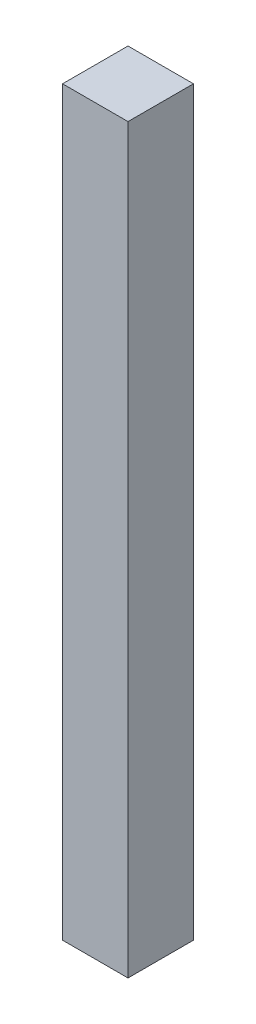
ISO-10303-21;
HEADER;
FILE_DESCRIPTION(('STEP AP214'),'2;1');
FILE_NAME('part.step','',(''),(''),'','','');
FILE_SCHEMA(('AUTOMOTIVE_DESIGN { 1 0 10303 214 1 1 1 1 }'));
ENDSEC;
DATA;
#1=APPLICATION_CONTEXT('core data for automotive mechanical design processes');
#2=APPLICATION_PROTOCOL_DEFINITION('international standard','automotive_design',2000,#1);
#3=PRODUCT_CONTEXT('',#1,'mechanical');
#4=PRODUCT('Part','Part','',(#3));
#5=PRODUCT_RELATED_PRODUCT_CATEGORY('part','',(#4));
#6=PRODUCT_DEFINITION_FORMATION('','',#4);
#7=PRODUCT_DEFINITION_CONTEXT('part definition',#1,'design');
#8=PRODUCT_DEFINITION('design','',#6,#7);
#9=PRODUCT_DEFINITION_SHAPE('','',#8);
#10=(LENGTH_UNIT() NAMED_UNIT(*) SI_UNIT(.MILLI.,.METRE.));
#11=(NAMED_UNIT(*) PLANE_ANGLE_UNIT() SI_UNIT($,.RADIAN.));
#12=(NAMED_UNIT(*) SI_UNIT($,.STERADIAN.) SOLID_ANGLE_UNIT());
#13=UNCERTAINTY_MEASURE_WITH_UNIT(LENGTH_MEASURE(1.E-05),#10,'distance_accuracy_value','');
#14=(GEOMETRIC_REPRESENTATION_CONTEXT(3) GLOBAL_UNCERTAINTY_ASSIGNED_CONTEXT((#13)) GLOBAL_UNIT_ASSIGNED_CONTEXT((#10,
#11,#12)) REPRESENTATION_CONTEXT('',''));
#15=CARTESIAN_POINT('',(0.,0.,0.));
#16=DIRECTION('',(0.,0.,1.));
#17=DIRECTION('',(1.,0.,0.));
#18=AXIS2_PLACEMENT_3D('',#15,#16,#17);
#19=CARTESIAN_POINT('',(-3.,68.,-3.));
#20=DIRECTION('',(1.,0.,0.));
#21=DIRECTION('',(0.,0.,-1.));
#22=AXIS2_PLACEMENT_3D('',#19,#20,#21);
#23=PLANE('',#22);
#24=DIRECTION('',(0.,0.,1.));
#25=VECTOR('',#24,1.);
#26=CARTESIAN_POINT('',(-3.,0.,-3.));
#27=LINE('',#26,#25);
#28=CARTESIAN_POINT('',(-3.,0.,-3.));
#29=VERTEX_POINT('',#28);
#30=CARTESIAN_POINT('',(-3.,0.,3.));
#31=VERTEX_POINT('',#30);
#32=EDGE_CURVE('E96',#29,#31,#27,.T.);
#33=ORIENTED_EDGE('',*,*,#32,.T.);
#34=DIRECTION('',(0.,-1.,0.));
#35=VECTOR('',#34,1.);
#36=CARTESIAN_POINT('',(-3.,68.,3.));
#37=LINE('',#36,#35);
#38=CARTESIAN_POINT('',(-3.,68.,3.));
#39=VERTEX_POINT('',#38);
#40=EDGE_CURVE('E11',#39,#31,#37,.T.);
#41=ORIENTED_EDGE('',*,*,#40,.F.);
#42=DIRECTION('',(0.,0.,1.));
#43=VECTOR('',#42,1.);
#44=CARTESIAN_POINT('',(-3.,68.,-3.));
#45=LINE('',#44,#43);
#46=CARTESIAN_POINT('',(-3.,68.,-3.));
#47=VERTEX_POINT('',#46);
#48=EDGE_CURVE('E84',#47,#39,#45,.T.);
#49=ORIENTED_EDGE('',*,*,#48,.F.);
#50=DIRECTION('',(0.,-1.,0.));
#51=VECTOR('',#50,1.);
#52=CARTESIAN_POINT('',(-3.,68.,-3.));
#53=LINE('',#52,#51);
#54=EDGE_CURVE('E92',#47,#29,#53,.T.);
#55=ORIENTED_EDGE('',*,*,#54,.T.);
#56=EDGE_LOOP('',(#33,#41,#49,#55));
#57=FACE_BOUND('',#56,.T.);
#58=ADVANCED_FACE('F33',(#57),#23,.F.);
#59=CARTESIAN_POINT('',(3.,68.,3.));
#60=DIRECTION('',(0.,0.,-1.));
#61=DIRECTION('',(-1.,0.,0.));
#62=AXIS2_PLACEMENT_3D('',#59,#60,#61);
#63=PLANE('',#62);
#64=DIRECTION('',(1.,0.,0.));
#65=VECTOR('',#64,1.);
#66=CARTESIAN_POINT('',(3.,0.,3.));
#67=LINE('',#66,#65);
#68=CARTESIAN_POINT('',(3.,0.,3.));
#69=VERTEX_POINT('',#68);
#70=EDGE_CURVE('E88',#31,#69,#67,.T.);
#71=ORIENTED_EDGE('',*,*,#70,.T.);
#72=DIRECTION('',(0.,-1.,0.));
#73=VECTOR('',#72,1.);
#74=CARTESIAN_POINT('',(3.,68.,3.));
#75=LINE('',#74,#73);
#76=CARTESIAN_POINT('',(3.,68.,3.));
#77=VERTEX_POINT('',#76);
#78=EDGE_CURVE('E41',#77,#69,#75,.T.);
#79=ORIENTED_EDGE('',*,*,#78,.F.);
#80=DIRECTION('',(1.,0.,0.));
#81=VECTOR('',#80,1.);
#82=CARTESIAN_POINT('',(3.,68.,3.));
#83=LINE('',#82,#81);
#84=EDGE_CURVE('E79',#39,#77,#83,.T.);
#85=ORIENTED_EDGE('',*,*,#84,.F.);
#86=ORIENTED_EDGE('',*,*,#40,.T.);
#87=EDGE_LOOP('',(#71,#79,#85,#86));
#88=FACE_BOUND('',#87,.T.);
#89=ADVANCED_FACE('F87',(#88),#63,.F.);
#90=CARTESIAN_POINT('',(3.,68.,-3.));
#91=DIRECTION('',(-1.,0.,0.));
#92=DIRECTION('',(0.,0.,1.));
#93=AXIS2_PLACEMENT_3D('',#90,#91,#92);
#94=PLANE('',#93);
#95=DIRECTION('',(0.,0.,-1.));
#96=VECTOR('',#95,1.);
#97=CARTESIAN_POINT('',(3.,0.,-3.));
#98=LINE('',#97,#96);
#99=CARTESIAN_POINT('',(3.,0.,-3.));
#100=VERTEX_POINT('',#99);
#101=EDGE_CURVE('E66',#69,#100,#98,.T.);
#102=ORIENTED_EDGE('',*,*,#101,.T.);
#103=DIRECTION('',(0.,-1.,0.));
#104=VECTOR('',#103,1.);
#105=CARTESIAN_POINT('',(3.,68.,-3.));
#106=LINE('',#105,#104);
#107=CARTESIAN_POINT('',(3.,68.,-3.));
#108=VERTEX_POINT('',#107);
#109=EDGE_CURVE('E89',#108,#100,#106,.T.);
#110=ORIENTED_EDGE('',*,*,#109,.F.);
#111=DIRECTION('',(0.,0.,-1.));
#112=VECTOR('',#111,1.);
#113=CARTESIAN_POINT('',(3.,68.,-3.));
#114=LINE('',#113,#112);
#115=EDGE_CURVE('E82',#77,#108,#114,.T.);
#116=ORIENTED_EDGE('',*,*,#115,.F.);
#117=ORIENTED_EDGE('',*,*,#78,.T.);
#118=EDGE_LOOP('',(#102,#110,#116,#117));
#119=FACE_BOUND('',#118,.T.);
#120=ADVANCED_FACE('F90',(#119),#94,.F.);
#121=CARTESIAN_POINT('',(3.,68.,-3.));
#122=DIRECTION('',(0.,0.,1.));
#123=DIRECTION('',(1.,0.,0.));
#124=AXIS2_PLACEMENT_3D('',#121,#122,#123);
#125=PLANE('',#124);
#126=DIRECTION('',(-1.,0.,0.));
#127=VECTOR('',#126,1.);
#128=CARTESIAN_POINT('',(3.,0.,-3.));
#129=LINE('',#128,#127);
#130=EDGE_CURVE('E72',#100,#29,#129,.T.);
#131=ORIENTED_EDGE('',*,*,#130,.T.);
#132=ORIENTED_EDGE('',*,*,#54,.F.);
#133=DIRECTION('',(-1.,0.,0.));
#134=VECTOR('',#133,1.);
#135=CARTESIAN_POINT('',(3.,68.,-3.));
#136=LINE('',#135,#134);
#137=EDGE_CURVE('E49',#108,#47,#136,.T.);
#138=ORIENTED_EDGE('',*,*,#137,.F.);
#139=ORIENTED_EDGE('',*,*,#109,.T.);
#140=EDGE_LOOP('',(#131,#132,#138,#139));
#141=FACE_BOUND('',#140,.T.);
#142=ADVANCED_FACE('F103',(#141),#125,.F.);
#143=CARTESIAN_POINT('',(0.,68.,0.));
#144=DIRECTION('',(0.,-1.,0.));
#145=DIRECTION('',(0.,0.,-1.));
#146=AXIS2_PLACEMENT_3D('',#143,#144,#145);
#147=PLANE('',#146);
#148=ORIENTED_EDGE('',*,*,#48,.T.);
#149=ORIENTED_EDGE('',*,*,#84,.T.);
#150=ORIENTED_EDGE('',*,*,#115,.T.);
#151=ORIENTED_EDGE('',*,*,#137,.T.);
#152=EDGE_LOOP('',(#148,#149,#150,#151));
#153=FACE_BOUND('',#152,.T.);
#154=ADVANCED_FACE('F80',(#153),#147,.F.);
#155=CARTESIAN_POINT('',(0.,0.,0.));
#156=DIRECTION('',(0.,-1.,0.));
#157=DIRECTION('',(0.,0.,-1.));
#158=AXIS2_PLACEMENT_3D('',#155,#156,#157);
#159=PLANE('',#158);
#160=ORIENTED_EDGE('',*,*,#32,.F.);
#161=ORIENTED_EDGE('',*,*,#130,.F.);
#162=ORIENTED_EDGE('',*,*,#101,.F.);
#163=ORIENTED_EDGE('',*,*,#70,.F.);
#164=EDGE_LOOP('',(#160,#161,#162,#163));
#165=FACE_BOUND('',#164,.T.);
#166=ADVANCED_FACE('F106',(#165),#159,.T.);
#167=CLOSED_SHELL('',(#58,#89,#120,#142,#154,#166));
#168=MANIFOLD_SOLID_BREP('B2',#167);
#169=ADVANCED_BREP_SHAPE_REPRESENTATION('',(#18,#168),#14);
#170=SHAPE_DEFINITION_REPRESENTATION(#9,#169);
ENDSEC;
END-ISO-10303-21;
